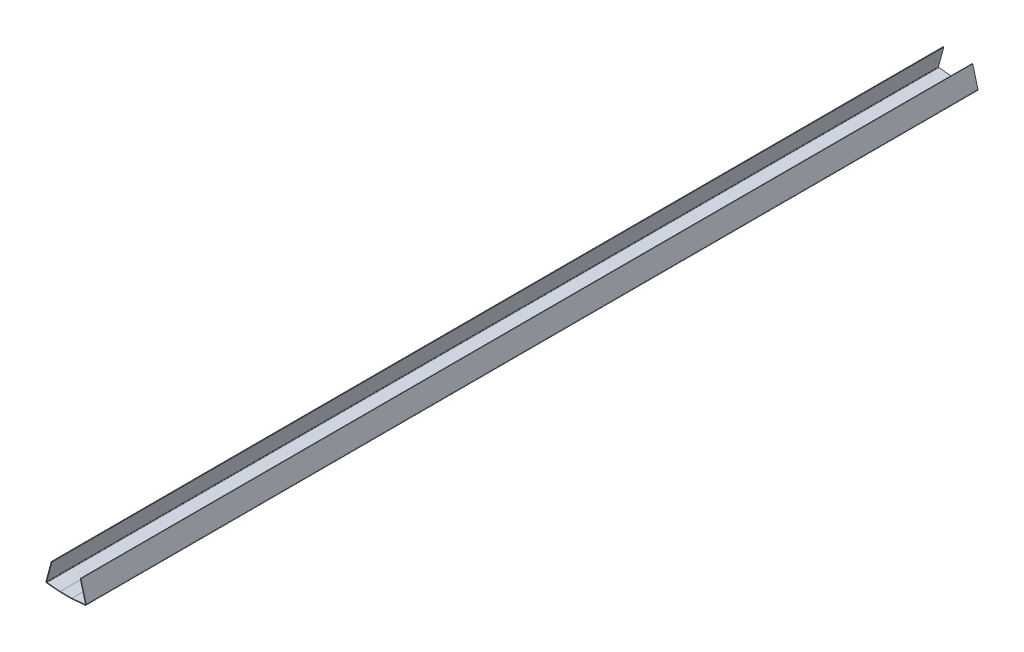
ISO-10303-21;
HEADER;
FILE_DESCRIPTION(('STEP AP214'),'2;1');
FILE_NAME('part.step','',(''),(''),'','','');
FILE_SCHEMA(('AUTOMOTIVE_DESIGN { 1 0 10303 214 1 1 1 1 }'));
ENDSEC;
DATA;
#1=APPLICATION_CONTEXT('core data for automotive mechanical design processes');
#2=APPLICATION_PROTOCOL_DEFINITION('international standard','automotive_design',2000,#1);
#3=PRODUCT_CONTEXT('',#1,'mechanical');
#4=PRODUCT('Part','Part','',(#3));
#5=PRODUCT_RELATED_PRODUCT_CATEGORY('part','',(#4));
#6=PRODUCT_DEFINITION_FORMATION('','',#4);
#7=PRODUCT_DEFINITION_CONTEXT('part definition',#1,'design');
#8=PRODUCT_DEFINITION('design','',#6,#7);
#9=PRODUCT_DEFINITION_SHAPE('','',#8);
#10=(LENGTH_UNIT() NAMED_UNIT(*) SI_UNIT(.MILLI.,.METRE.));
#11=(NAMED_UNIT(*) PLANE_ANGLE_UNIT() SI_UNIT($,.RADIAN.));
#12=(NAMED_UNIT(*) SI_UNIT($,.STERADIAN.) SOLID_ANGLE_UNIT());
#13=UNCERTAINTY_MEASURE_WITH_UNIT(LENGTH_MEASURE(1.E-05),#10,'distance_accuracy_value','');
#14=(GEOMETRIC_REPRESENTATION_CONTEXT(3) GLOBAL_UNCERTAINTY_ASSIGNED_CONTEXT((#13)) GLOBAL_UNIT_ASSIGNED_CONTEXT((#10,
#11,#12)) REPRESENTATION_CONTEXT('',''));
#15=CARTESIAN_POINT('',(0.,0.,0.));
#16=DIRECTION('',(0.,0.,1.));
#17=DIRECTION('',(1.,0.,0.));
#18=AXIS2_PLACEMENT_3D('',#15,#16,#17);
#19=CARTESIAN_POINT('',(32.5086896776147,4.10552978515184,-1447.8));
#20=DIRECTION('',(0.,0.,-1.));
#21=DIRECTION('',(-1.,0.,0.));
#22=AXIS2_PLACEMENT_3D('',#19,#20,#21);
#23=PLANE('',#22);
#24=DIRECTION('',(-0.965925826289067,-0.258819045102526,0.));
#25=VECTOR('',#24,1.);
#26=CARTESIAN_POINT('',(32.5086896776147,4.10552978515184,-1447.8));
#27=LINE('',#26,#25);
#28=CARTESIAN_POINT('',(32.5086896776147,4.10552978515184,-1447.8));
#29=VERTEX_POINT('',#28);
#30=CARTESIAN_POINT('',(31.527309038105,3.84256963532774,-1447.8));
#31=VERTEX_POINT('',#30);
#32=EDGE_CURVE('E11',#29,#31,#27,.T.);
#33=ORIENTED_EDGE('',*,*,#32,.F.);
#34=CARTESIAN_POINT('',(30.7912735584728,3.64534952295957,-1447.8));
#35=DIRECTION('',(0.,0.,1.));
#36=DIRECTION('',(1.,0.,0.));
#37=AXIS2_PLACEMENT_3D('',#34,#35,#36);
#38=CIRCLE('',#37,1.778);
#39=CARTESIAN_POINT('',(30.9462364690778,1.87411534975242,-1447.8));
#40=VERTEX_POINT('',#39);
#41=EDGE_CURVE('E270',#29,#40,#38,.F.);
#42=ORIENTED_EDGE('',*,*,#41,.T.);
#43=DIRECTION('',(0.0871557427476502,-0.996194698091747,0.));
#44=VECTOR('',#43,1.);
#45=CARTESIAN_POINT('',(30.8576862344465,2.88624916301371,-1447.8));
#46=LINE('',#45,#44);
#47=CARTESIAN_POINT('',(30.8576862344465,2.88624916301371,-1447.8));
#48=VERTEX_POINT('',#47);
#49=EDGE_CURVE('E41',#48,#40,#46,.T.);
#50=ORIENTED_EDGE('',*,*,#49,.F.);
#51=CARTESIAN_POINT('',(30.7912735584728,3.64534952295957,-1447.8));
#52=DIRECTION('',(0.,0.,1.));
#53=DIRECTION('',(1.,0.,0.));
#54=AXIS2_PLACEMENT_3D('',#51,#52,#53);
#55=CIRCLE('',#54,0.762);
#56=EDGE_CURVE('E281',#31,#48,#55,.F.);
#57=ORIENTED_EDGE('',*,*,#56,.F.);
#58=EDGE_LOOP('',(#33,#42,#50,#57));
#59=FACE_BOUND('',#58,.T.);
#60=ADVANCED_FACE('F34',(#59),#23,.T.);
#61=CARTESIAN_POINT('',(30.8576862344465,2.88624916301371,-1447.8));
#62=DIRECTION('',(0.,0.,-1.));
#63=DIRECTION('',(-1.,0.,0.));
#64=AXIS2_PLACEMENT_3D('',#61,#62,#63);
#65=PLANE('',#64);
#66=DIRECTION('',(0.258819045102526,-0.965925826289067,0.));
#67=VECTOR('',#66,1.);
#68=CARTESIAN_POINT('',(33.0571111583233,2.05879295518523,-1447.8));
#69=LINE('',#68,#67);
#70=CARTESIAN_POINT('',(24.0178560081175,35.7937524383308,-1447.8));
#71=VERTEX_POINT('',#70);
#72=EDGE_CURVE('E273',#71,#29,#69,.T.);
#73=ORIENTED_EDGE('',*,*,#72,.T.);
#74=ORIENTED_EDGE('',*,*,#32,.T.);
#75=DIRECTION('',(0.258819045102526,-0.965925826289067,0.));
#76=VECTOR('',#75,1.);
#77=CARTESIAN_POINT('',(32.0757305188135,1.79583280536101,-1447.8));
#78=LINE('',#77,#76);
#79=CARTESIAN_POINT('',(23.0364753686079,35.5307922885067,-1447.8));
#80=VERTEX_POINT('',#79);
#81=EDGE_CURVE('E278',#80,#31,#78,.T.);
#82=ORIENTED_EDGE('',*,*,#81,.F.);
#83=DIRECTION('',(0.965925826289069,0.258819045102519,0.));
#84=VECTOR('',#83,1.);
#85=CARTESIAN_POINT('',(23.0364753686079,35.5307922885067,-1447.8));
#86=LINE('',#85,#84);
#87=EDGE_CURVE('E276',#80,#71,#86,.T.);
#88=ORIENTED_EDGE('',*,*,#87,.T.);
#89=EDGE_LOOP('',(#73,#74,#82,#88));
#90=FACE_BOUND('',#89,.T.);
#91=ADVANCED_FACE('F421',(#90),#65,.T.);
#92=CARTESIAN_POINT('',(30.946236469078,1.87411534975243,0.));
#93=DIRECTION('',(0.,0.,1.));
#94=DIRECTION('',(1.,0.,0.));
#95=AXIS2_PLACEMENT_3D('',#92,#93,#94);
#96=PLANE('',#95);
#97=DIRECTION('',(-0.0871557427476502,0.996194698091747,0.));
#98=VECTOR('',#97,1.);
#99=CARTESIAN_POINT('',(30.946236469078,1.87411534975243,0.));
#100=LINE('',#99,#98);
#101=CARTESIAN_POINT('',(30.946236469078,1.87411534975243,0.));
#102=VERTEX_POINT('',#101);
#103=CARTESIAN_POINT('',(30.8576862344464,2.88624916301362,-1.11022302462516E-13));
#104=VERTEX_POINT('',#103);
#105=EDGE_CURVE('E377',#102,#104,#100,.T.);
#106=ORIENTED_EDGE('',*,*,#105,.F.);
#107=CARTESIAN_POINT('',(30.7912735584727,3.64534952295954,-1.11022302462516E-13));
#108=DIRECTION('',(0.,0.,1.));
#109=DIRECTION('',(1.,0.,0.));
#110=AXIS2_PLACEMENT_3D('',#107,#108,#109);
#111=CIRCLE('',#110,1.778);
#112=CARTESIAN_POINT('',(32.5086896776144,4.10552978515184,-2.22044604925031E-13));
#113=VERTEX_POINT('',#112);
#114=EDGE_CURVE('E218',#113,#102,#111,.F.);
#115=ORIENTED_EDGE('',*,*,#114,.F.);
#116=DIRECTION('',(0.965925826289067,0.258819045102526,0.));
#117=VECTOR('',#116,1.);
#118=CARTESIAN_POINT('',(31.5273090381047,3.84256963532767,0.));
#119=LINE('',#118,#117);
#120=CARTESIAN_POINT('',(31.5273090381047,3.84256963532767,0.));
#121=VERTEX_POINT('',#120);
#122=EDGE_CURVE('E375',#121,#113,#119,.T.);
#123=ORIENTED_EDGE('',*,*,#122,.F.);
#124=CARTESIAN_POINT('',(30.7912735584727,3.64534952295954,-1.11022302462516E-13));
#125=DIRECTION('',(0.,0.,1.));
#126=DIRECTION('',(1.,0.,0.));
#127=AXIS2_PLACEMENT_3D('',#124,#125,#126);
#128=CIRCLE('',#127,0.762);
#129=EDGE_CURVE('E229',#121,#104,#128,.F.);
#130=ORIENTED_EDGE('',*,*,#129,.T.);
#131=EDGE_LOOP('',(#106,#115,#123,#130));
#132=FACE_BOUND('',#131,.T.);
#133=ADVANCED_FACE('F429',(#132),#96,.T.);
#134=CARTESIAN_POINT('',(31.5273090381047,3.84256963532767,0.));
#135=DIRECTION('',(0.,0.,1.));
#136=DIRECTION('',(1.,0.,0.));
#137=AXIS2_PLACEMENT_3D('',#134,#135,#136);
#138=PLANE('',#137);
#139=DIRECTION('',(-0.996194698091746,-0.0871557427476584,0.));
#140=VECTOR('',#139,1.);
#141=CARTESIAN_POINT('',(9.52500000000001,0.,0.));
#142=LINE('',#141,#140);
#143=CARTESIAN_POINT('',(9.60233375411434,0.00676582679290383,0.));
#144=VERTEX_POINT('',#143);
#145=EDGE_CURVE('E215',#102,#144,#142,.T.);
#146=ORIENTED_EDGE('',*,*,#145,.F.);
#147=ORIENTED_EDGE('',*,*,#105,.T.);
#148=DIRECTION('',(-0.996194698091746,-0.0871557427476584,0.));
#149=VECTOR('',#148,1.);
#150=CARTESIAN_POINT('',(9.43644976536828,1.01213381326121,-1.11022302462516E-13));
#151=LINE('',#150,#149);
#152=CARTESIAN_POINT('',(9.51378351948273,1.0188996400541,0.));
#153=VERTEX_POINT('',#152);
#154=EDGE_CURVE('E232',#104,#153,#151,.T.);
#155=ORIENTED_EDGE('',*,*,#154,.T.);
#156=DIRECTION('',(0.0871557427476583,-0.996194698091746,0.));
#157=VECTOR('',#156,1.);
#158=CARTESIAN_POINT('',(9.51378351948273,1.0188996400541,0.));
#159=LINE('',#158,#157);
#160=EDGE_CURVE('E367',#153,#144,#159,.T.);
#161=ORIENTED_EDGE('',*,*,#160,.T.);
#162=EDGE_LOOP('',(#146,#147,#155,#161));
#163=FACE_BOUND('',#162,.T.);
#164=ADVANCED_FACE('F431',(#163),#138,.T.);
#165=CARTESIAN_POINT('',(9.60233375411446,0.00676582679291771,-1447.8));
#166=DIRECTION('',(0.,0.,-1.));
#167=DIRECTION('',(-1.,0.,0.));
#168=AXIS2_PLACEMENT_3D('',#165,#166,#167);
#169=PLANE('',#168);
#170=DIRECTION('',(-0.0871557427476583,0.996194698091746,0.));
#171=VECTOR('',#170,1.);
#172=CARTESIAN_POINT('',(9.60233375411446,0.00676582679291771,-1447.8));
#173=LINE('',#172,#171);
#174=CARTESIAN_POINT('',(9.60233375411446,0.00676582679291771,-1447.8));
#175=VERTEX_POINT('',#174);
#176=CARTESIAN_POINT('',(9.51378351948273,1.01889964005407,-1447.8));
#177=VERTEX_POINT('',#176);
#178=EDGE_CURVE('E373',#175,#177,#173,.T.);
#179=ORIENTED_EDGE('',*,*,#178,.F.);
#180=CARTESIAN_POINT('',(9.44737084350911,1.77800000000007,-1447.8));
#181=DIRECTION('',(0.,0.,1.));
#182=DIRECTION('',(1.,0.,0.));
#183=AXIS2_PLACEMENT_3D('',#180,#181,#182);
#184=CIRCLE('',#183,1.778);
#185=CARTESIAN_POINT('',(9.44737084350911,0.,-1447.8));
#186=VERTEX_POINT('',#185);
#187=EDGE_CURVE('E264',#175,#186,#184,.F.);
#188=ORIENTED_EDGE('',*,*,#187,.T.);
#189=DIRECTION('',(0.,-1.,0.));
#190=VECTOR('',#189,1.);
#191=CARTESIAN_POINT('',(9.447370843509,1.01600000000006,-1447.8));
#192=LINE('',#191,#190);
#193=CARTESIAN_POINT('',(9.447370843509,1.01600000000006,-1447.8));
#194=VERTEX_POINT('',#193);
#195=EDGE_CURVE('E371',#194,#186,#192,.T.);
#196=ORIENTED_EDGE('',*,*,#195,.F.);
#197=CARTESIAN_POINT('',(9.44737084350911,1.77800000000007,-1447.8));
#198=DIRECTION('',(0.,0.,1.));
#199=DIRECTION('',(1.,0.,0.));
#200=AXIS2_PLACEMENT_3D('',#197,#198,#199);
#201=CIRCLE('',#200,0.762);
#202=EDGE_CURVE('E287',#177,#194,#201,.F.);
#203=ORIENTED_EDGE('',*,*,#202,.F.);
#204=EDGE_LOOP('',(#179,#188,#196,#203));
#205=FACE_BOUND('',#204,.T.);
#206=ADVANCED_FACE('F401',(#205),#169,.T.);
#207=CARTESIAN_POINT('',(9.447370843509,1.01600000000006,-1447.8));
#208=DIRECTION('',(0.,0.,-1.));
#209=DIRECTION('',(-1.,0.,0.));
#210=AXIS2_PLACEMENT_3D('',#207,#208,#209);
#211=PLANE('',#210);
#212=DIRECTION('',(-0.996194698091746,-0.0871557427476584,0.));
#213=VECTOR('',#212,1.);
#214=CARTESIAN_POINT('',(9.52500000000001,0.,-1447.8));
#215=LINE('',#214,#213);
#216=EDGE_CURVE('E267',#40,#175,#215,.T.);
#217=ORIENTED_EDGE('',*,*,#216,.T.);
#218=ORIENTED_EDGE('',*,*,#178,.T.);
#219=DIRECTION('',(-0.996194698091746,-0.0871557427476584,0.));
#220=VECTOR('',#219,1.);
#221=CARTESIAN_POINT('',(9.4364497653685,1.01213381326125,-1447.8));
#222=LINE('',#221,#220);
#223=EDGE_CURVE('E284',#48,#177,#222,.T.);
#224=ORIENTED_EDGE('',*,*,#223,.F.);
#225=ORIENTED_EDGE('',*,*,#49,.T.);
#226=EDGE_LOOP('',(#217,#218,#224,#225));
#227=FACE_BOUND('',#226,.T.);
#228=ADVANCED_FACE('F380',(#227),#211,.T.);
#229=CARTESIAN_POINT('',(9.447370843509,0.,-1.11022302462516E-13));
#230=DIRECTION('',(0.,0.,1.));
#231=DIRECTION('',(1.,0.,0.));
#232=AXIS2_PLACEMENT_3D('',#229,#230,#231);
#233=PLANE('',#232);
#234=DIRECTION('',(0.,1.,0.));
#235=VECTOR('',#234,1.);
#236=CARTESIAN_POINT('',(9.447370843509,0.,-1.11022302462516E-13));
#237=LINE('',#236,#235);
#238=CARTESIAN_POINT('',(9.447370843509,0.,-1.11022302462516E-13));
#239=VERTEX_POINT('',#238);
#240=CARTESIAN_POINT('',(9.447370843509,1.016,-1.11022302462516E-13));
#241=VERTEX_POINT('',#240);
#242=EDGE_CURVE('E369',#239,#241,#237,.T.);
#243=ORIENTED_EDGE('',*,*,#242,.F.);
#244=CARTESIAN_POINT('',(9.447370843509,1.778,-1.11022302462516E-13));
#245=DIRECTION('',(0.,0.,1.));
#246=DIRECTION('',(1.,0.,0.));
#247=AXIS2_PLACEMENT_3D('',#244,#245,#246);
#248=CIRCLE('',#247,1.778);
#249=EDGE_CURVE('E212',#144,#239,#248,.F.);
#250=ORIENTED_EDGE('',*,*,#249,.F.);
#251=ORIENTED_EDGE('',*,*,#160,.F.);
#252=CARTESIAN_POINT('',(9.447370843509,1.778,-1.11022302462516E-13));
#253=DIRECTION('',(0.,0.,1.));
#254=DIRECTION('',(1.,0.,0.));
#255=AXIS2_PLACEMENT_3D('',#252,#253,#254);
#256=CIRCLE('',#255,0.762);
#257=EDGE_CURVE('E235',#153,#241,#256,.F.);
#258=ORIENTED_EDGE('',*,*,#257,.T.);
#259=EDGE_LOOP('',(#243,#250,#251,#258));
#260=FACE_BOUND('',#259,.T.);
#261=ADVANCED_FACE('F433',(#260),#233,.T.);
#262=CARTESIAN_POINT('',(9.51378351948273,1.0188996400541,0.));
#263=DIRECTION('',(0.,0.,1.));
#264=DIRECTION('',(1.,0.,0.));
#265=AXIS2_PLACEMENT_3D('',#262,#263,#264);
#266=PLANE('',#265);
#267=DIRECTION('',(-1.,0.,0.));
#268=VECTOR('',#267,1.);
#269=CARTESIAN_POINT('',(-9.52500000000023,0.,0.));
#270=LINE('',#269,#268);
#271=CARTESIAN_POINT('',(-9.44737084350889,0.,0.));
#272=VERTEX_POINT('',#271);
#273=EDGE_CURVE('E209',#239,#272,#270,.T.);
#274=ORIENTED_EDGE('',*,*,#273,.F.);
#275=ORIENTED_EDGE('',*,*,#242,.T.);
#276=DIRECTION('',(-1.,0.,0.));
#277=VECTOR('',#276,1.);
#278=CARTESIAN_POINT('',(-9.52500000000012,1.01599999999999,0.));
#279=LINE('',#278,#277);
#280=CARTESIAN_POINT('',(-9.44737084350877,1.016,-1.11022302462516E-13));
#281=VERTEX_POINT('',#280);
#282=EDGE_CURVE('E238',#241,#281,#279,.T.);
#283=ORIENTED_EDGE('',*,*,#282,.T.);
#284=DIRECTION('',(0.,-1.,0.));
#285=VECTOR('',#284,1.);
#286=CARTESIAN_POINT('',(-9.44737084350877,1.016,-1.11022302462516E-13));
#287=LINE('',#286,#285);
#288=EDGE_CURVE('E359',#281,#272,#287,.T.);
#289=ORIENTED_EDGE('',*,*,#288,.T.);
#290=EDGE_LOOP('',(#274,#275,#283,#289));
#291=FACE_BOUND('',#290,.T.);
#292=ADVANCED_FACE('F439',(#291),#266,.T.);
#293=CARTESIAN_POINT('',(-9.44737084350877,0.,-1447.8));
#294=DIRECTION('',(0.,0.,-1.));
#295=DIRECTION('',(-1.,0.,0.));
#296=AXIS2_PLACEMENT_3D('',#293,#294,#295);
#297=PLANE('',#296);
#298=DIRECTION('',(0.,1.,0.));
#299=VECTOR('',#298,1.);
#300=CARTESIAN_POINT('',(-9.44737084350877,0.,-1447.8));
#301=LINE('',#300,#299);
#302=CARTESIAN_POINT('',(-9.44737084350877,0.,-1447.8));
#303=VERTEX_POINT('',#302);
#304=CARTESIAN_POINT('',(-9.44737084350866,1.016,-1447.8));
#305=VERTEX_POINT('',#304);
#306=EDGE_CURVE('E365',#303,#305,#301,.T.);
#307=ORIENTED_EDGE('',*,*,#306,.F.);
#308=CARTESIAN_POINT('',(-9.44737084350877,1.77800000000002,-1447.8));
#309=DIRECTION('',(0.,0.,1.));
#310=DIRECTION('',(1.,0.,0.));
#311=AXIS2_PLACEMENT_3D('',#308,#309,#310);
#312=CIRCLE('',#311,1.778);
#313=CARTESIAN_POINT('',(-9.60233375411401,0.00676582679291771,-1447.8));
#314=VERTEX_POINT('',#313);
#315=EDGE_CURVE('E258',#303,#314,#312,.F.);
#316=ORIENTED_EDGE('',*,*,#315,.T.);
#317=DIRECTION('',(-0.0871557427476586,-0.996194698091746,0.));
#318=VECTOR('',#317,1.);
#319=CARTESIAN_POINT('',(-9.51378351948251,1.01889964005412,-1447.8));
#320=LINE('',#319,#318);
#321=CARTESIAN_POINT('',(-9.51378351948251,1.01889964005412,-1447.8));
#322=VERTEX_POINT('',#321);
#323=EDGE_CURVE('E363',#322,#314,#320,.T.);
#324=ORIENTED_EDGE('',*,*,#323,.F.);
#325=CARTESIAN_POINT('',(-9.44737084350877,1.77800000000002,-1447.8));
#326=DIRECTION('',(0.,0.,1.));
#327=DIRECTION('',(1.,0.,0.));
#328=AXIS2_PLACEMENT_3D('',#325,#326,#327);
#329=CIRCLE('',#328,0.762);
#330=EDGE_CURVE('E293',#305,#322,#329,.F.);
#331=ORIENTED_EDGE('',*,*,#330,.F.);
#332=EDGE_LOOP('',(#307,#316,#324,#331));
#333=FACE_BOUND('',#332,.T.);
#334=ADVANCED_FACE('F485',(#333),#297,.T.);
#335=CARTESIAN_POINT('',(-9.51378351948251,1.01889964005412,-1447.8));
#336=DIRECTION('',(0.,0.,-1.));
#337=DIRECTION('',(-1.,0.,0.));
#338=AXIS2_PLACEMENT_3D('',#335,#336,#337);
#339=PLANE('',#338);
#340=DIRECTION('',(-1.,0.,0.));
#341=VECTOR('',#340,1.);
#342=CARTESIAN_POINT('',(-9.52499999999978,0.,-1447.8));
#343=LINE('',#342,#341);
#344=EDGE_CURVE('E261',#186,#303,#343,.T.);
#345=ORIENTED_EDGE('',*,*,#344,.T.);
#346=ORIENTED_EDGE('',*,*,#306,.T.);
#347=DIRECTION('',(-1.,0.,0.));
#348=VECTOR('',#347,1.);
#349=CARTESIAN_POINT('',(-9.5249999999999,1.01599999999998,-1447.8));
#350=LINE('',#349,#348);
#351=EDGE_CURVE('E290',#194,#305,#350,.T.);
#352=ORIENTED_EDGE('',*,*,#351,.F.);
#353=ORIENTED_EDGE('',*,*,#195,.T.);
#354=EDGE_LOOP('',(#345,#346,#352,#353));
#355=FACE_BOUND('',#354,.T.);
#356=ADVANCED_FACE('F487',(#355),#339,.T.);
#357=CARTESIAN_POINT('',(-9.60233375411401,0.0067658267928622,-1.11022302462516E-13));
#358=DIRECTION('',(0.,0.,1.));
#359=DIRECTION('',(1.,0.,0.));
#360=AXIS2_PLACEMENT_3D('',#357,#358,#359);
#361=PLANE('',#360);
#362=DIRECTION('',(0.0871557427476586,0.996194698091746,0.));
#363=VECTOR('',#362,1.);
#364=CARTESIAN_POINT('',(-9.60233375411401,0.0067658267928622,-1.11022302462516E-13));
#365=LINE('',#364,#363);
#366=CARTESIAN_POINT('',(-9.60233375411401,0.0067658267928622,-1.11022302462516E-13));
#367=VERTEX_POINT('',#366);
#368=CARTESIAN_POINT('',(-9.5137835194824,1.0188996400541,0.));
#369=VERTEX_POINT('',#368);
#370=EDGE_CURVE('E361',#367,#369,#365,.T.);
#371=ORIENTED_EDGE('',*,*,#370,.F.);
#372=CARTESIAN_POINT('',(-9.44737084350877,1.778,0.));
#373=DIRECTION('',(0.,0.,1.));
#374=DIRECTION('',(1.,0.,0.));
#375=AXIS2_PLACEMENT_3D('',#372,#373,#374);
#376=CIRCLE('',#375,1.778);
#377=EDGE_CURVE('E206',#272,#367,#376,.F.);
#378=ORIENTED_EDGE('',*,*,#377,.F.);
#379=ORIENTED_EDGE('',*,*,#288,.F.);
#380=CARTESIAN_POINT('',(-9.44737084350877,1.778,0.));
#381=DIRECTION('',(0.,0.,1.));
#382=DIRECTION('',(1.,0.,0.));
#383=AXIS2_PLACEMENT_3D('',#380,#381,#382);
#384=CIRCLE('',#383,0.762);
#385=EDGE_CURVE('E241',#281,#369,#384,.F.);
#386=ORIENTED_EDGE('',*,*,#385,.T.);
#387=EDGE_LOOP('',(#371,#378,#379,#386));
#388=FACE_BOUND('',#387,.T.);
#389=ADVANCED_FACE('F443',(#388),#361,.T.);
#390=CARTESIAN_POINT('',(-9.44737084350877,1.016,-1.11022302462516E-13));
#391=DIRECTION('',(0.,0.,1.));
#392=DIRECTION('',(1.,0.,0.));
#393=AXIS2_PLACEMENT_3D('',#390,#391,#392);
#394=PLANE('',#393);
#395=DIRECTION('',(-0.996194698091746,0.087155742747658,0.));
#396=VECTOR('',#395,1.);
#397=CARTESIAN_POINT('',(-9.52500000000023,0.,0.));
#398=LINE('',#397,#396);
#399=CARTESIAN_POINT('',(-30.9462364690779,1.87411534975242,-1.11022302462516E-13));
#400=VERTEX_POINT('',#399);
#401=EDGE_CURVE('E203',#367,#400,#398,.T.);
#402=ORIENTED_EDGE('',*,*,#401,.F.);
#403=ORIENTED_EDGE('',*,*,#370,.T.);
#404=DIRECTION('',(-0.996194698091746,0.087155742747658,0.));
#405=VECTOR('',#404,1.);
#406=CARTESIAN_POINT('',(-9.43644976536839,1.01213381326119,0.));
#407=LINE('',#406,#405);
#408=CARTESIAN_POINT('',(-30.8576862344465,2.88624916301362,-1.11022302462516E-13));
#409=VERTEX_POINT('',#408);
#410=EDGE_CURVE('E244',#369,#409,#407,.T.);
#411=ORIENTED_EDGE('',*,*,#410,.T.);
#412=DIRECTION('',(-0.0871557427476569,-0.996194698091746,0.));
#413=VECTOR('',#412,1.);
#414=CARTESIAN_POINT('',(-30.8576862344465,2.88624916301362,-1.11022302462516E-13));
#415=LINE('',#414,#413);
#416=EDGE_CURVE('E303',#409,#400,#415,.T.);
#417=ORIENTED_EDGE('',*,*,#416,.T.);
#418=EDGE_LOOP('',(#402,#403,#411,#417));
#419=FACE_BOUND('',#418,.T.);
#420=ADVANCED_FACE('F459',(#419),#394,.T.);
#421=CARTESIAN_POINT('',(-30.9462364690779,1.87411534975244,-1447.8));
#422=DIRECTION('',(0.,0.,-1.));
#423=DIRECTION('',(-1.,0.,0.));
#424=AXIS2_PLACEMENT_3D('',#421,#422,#423);
#425=PLANE('',#424);
#426=DIRECTION('',(0.0871557427476569,0.996194698091746,0.));
#427=VECTOR('',#426,1.);
#428=CARTESIAN_POINT('',(-30.9462364690779,1.87411534975244,-1447.8));
#429=LINE('',#428,#427);
#430=CARTESIAN_POINT('',(-30.9462364690779,1.87411534975244,-1447.8));
#431=VERTEX_POINT('',#430);
#432=CARTESIAN_POINT('',(-30.8576862344463,2.88624916301371,-1447.8));
#433=VERTEX_POINT('',#432);
#434=EDGE_CURVE('E56',#431,#433,#429,.T.);
#435=ORIENTED_EDGE('',*,*,#434,.F.);
#436=CARTESIAN_POINT('',(-30.7912735584726,3.64534952295954,-1447.8));
#437=DIRECTION('',(0.,0.,1.));
#438=DIRECTION('',(1.,0.,0.));
#439=AXIS2_PLACEMENT_3D('',#436,#437,#438);
#440=CIRCLE('',#439,1.778);
#441=CARTESIAN_POINT('',(-32.5086896776146,4.10552978515184,-1447.8));
#442=VERTEX_POINT('',#441);
#443=EDGE_CURVE('E254',#431,#442,#440,.F.);
#444=ORIENTED_EDGE('',*,*,#443,.T.);
#445=DIRECTION('',(-0.965925826289068,0.258819045102525,0.));
#446=VECTOR('',#445,1.);
#447=CARTESIAN_POINT('',(-31.5273090381049,3.84256963532774,-1447.8));
#448=LINE('',#447,#446);
#449=CARTESIAN_POINT('',(-31.5273090381049,3.84256963532774,-1447.8));
#450=VERTEX_POINT('',#449);
#451=EDGE_CURVE('E48',#450,#442,#448,.T.);
#452=ORIENTED_EDGE('',*,*,#451,.F.);
#453=CARTESIAN_POINT('',(-30.7912735584726,3.64534952295954,-1447.8));
#454=DIRECTION('',(0.,0.,1.));
#455=DIRECTION('',(1.,0.,0.));
#456=AXIS2_PLACEMENT_3D('',#453,#454,#455);
#457=CIRCLE('',#456,0.762);
#458=EDGE_CURVE('E183',#433,#450,#457,.F.);
#459=ORIENTED_EDGE('',*,*,#458,.F.);
#460=EDGE_LOOP('',(#435,#444,#452,#459));
#461=FACE_BOUND('',#460,.T.);
#462=ADVANCED_FACE('F475',(#461),#425,.T.);
#463=CARTESIAN_POINT('',(-31.5273090381049,3.84256963532774,-1447.8));
#464=DIRECTION('',(0.,0.,-1.));
#465=DIRECTION('',(-1.,0.,0.));
#466=AXIS2_PLACEMENT_3D('',#463,#464,#465);
#467=PLANE('',#466);
#468=DIRECTION('',(-0.996194698091746,0.087155742747658,0.));
#469=VECTOR('',#468,1.);
#470=CARTESIAN_POINT('',(-9.52499999999978,0.,-1447.8));
#471=LINE('',#470,#469);
#472=EDGE_CURVE('E256',#314,#431,#471,.T.);
#473=ORIENTED_EDGE('',*,*,#472,.T.);
#474=ORIENTED_EDGE('',*,*,#434,.T.);
#475=DIRECTION('',(-0.996194698091746,0.087155742747658,0.));
#476=VECTOR('',#475,1.);
#477=CARTESIAN_POINT('',(-9.4364497653685,1.01213381326125,-1447.8));
#478=LINE('',#477,#476);
#479=EDGE_CURVE('E296',#322,#433,#478,.T.);
#480=ORIENTED_EDGE('',*,*,#479,.F.);
#481=ORIENTED_EDGE('',*,*,#323,.T.);
#482=EDGE_LOOP('',(#473,#474,#480,#481));
#483=FACE_BOUND('',#482,.T.);
#484=ADVANCED_FACE('F477',(#483),#467,.T.);
#485=CARTESIAN_POINT('',(-32.5086896776147,4.10552978515183,-1.11022302462516E-13));
#486=DIRECTION('',(0.,0.,1.));
#487=DIRECTION('',(1.,0.,0.));
#488=AXIS2_PLACEMENT_3D('',#485,#486,#487);
#489=PLANE('',#488);
#490=DIRECTION('',(0.965925826289068,-0.258819045102525,0.));
#491=VECTOR('',#490,1.);
#492=CARTESIAN_POINT('',(-32.5086896776147,4.10552978515183,-1.11022302462516E-13));
#493=LINE('',#492,#491);
#494=CARTESIAN_POINT('',(-32.5086896776147,4.10552978515183,-1.11022302462516E-13));
#495=VERTEX_POINT('',#494);
#496=CARTESIAN_POINT('',(-31.5273090381051,3.84256963532766,0.));
#497=VERTEX_POINT('',#496);
#498=EDGE_CURVE('E195',#495,#497,#493,.T.);
#499=ORIENTED_EDGE('',*,*,#498,.F.);
#500=CARTESIAN_POINT('',(-30.7912735584727,3.64534952295953,-1.11022302462516E-13));
#501=DIRECTION('',(0.,0.,1.));
#502=DIRECTION('',(1.,0.,0.));
#503=AXIS2_PLACEMENT_3D('',#500,#501,#502);
#504=CIRCLE('',#503,1.778);
#505=EDGE_CURVE('E200',#400,#495,#504,.F.);
#506=ORIENTED_EDGE('',*,*,#505,.F.);
#507=ORIENTED_EDGE('',*,*,#416,.F.);
#508=CARTESIAN_POINT('',(-30.7912735584727,3.64534952295953,-1.11022302462516E-13));
#509=DIRECTION('',(0.,0.,1.));
#510=DIRECTION('',(1.,0.,0.));
#511=AXIS2_PLACEMENT_3D('',#508,#509,#510);
#512=CIRCLE('',#511,0.762);
#513=EDGE_CURVE('E247',#409,#497,#512,.F.);
#514=ORIENTED_EDGE('',*,*,#513,.T.);
#515=EDGE_LOOP('',(#499,#506,#507,#514));
#516=FACE_BOUND('',#515,.T.);
#517=ADVANCED_FACE('F463',(#516),#489,.T.);
#518=CARTESIAN_POINT('',(-30.8576862344465,2.88624916301362,-1.11022302462516E-13));
#519=DIRECTION('',(0.,0.,1.));
#520=DIRECTION('',(1.,0.,0.));
#521=AXIS2_PLACEMENT_3D('',#518,#519,#520);
#522=PLANE('',#521);
#523=DIRECTION('',(0.258819045102525,0.965925826289067,0.));
#524=VECTOR('',#523,1.);
#525=CARTESIAN_POINT('',(-33.0571111583233,2.05879295518517,-1.11022302462516E-13));
#526=LINE('',#525,#524);
#527=CARTESIAN_POINT('',(-24.0178560081177,35.7937524383308,-1.11022302462516E-13));
#528=VERTEX_POINT('',#527);
#529=EDGE_CURVE('E192',#495,#528,#526,.T.);
#530=ORIENTED_EDGE('',*,*,#529,.F.);
#531=ORIENTED_EDGE('',*,*,#498,.T.);
#532=DIRECTION('',(0.258819045102525,0.965925826289067,0.));
#533=VECTOR('',#532,1.);
#534=CARTESIAN_POINT('',(-32.0757305188136,1.79583280536101,0.));
#535=LINE('',#534,#533);
#536=CARTESIAN_POINT('',(-23.0364753686079,35.5307922885067,0.));
#537=VERTEX_POINT('',#536);
#538=EDGE_CURVE('E176',#497,#537,#535,.T.);
#539=ORIENTED_EDGE('',*,*,#538,.T.);
#540=DIRECTION('',(0.965925826289071,-0.258819045102512,0.));
#541=VECTOR('',#540,1.);
#542=CARTESIAN_POINT('',(-24.0178560081177,35.7937524383308,-1.11022302462516E-13));
#543=LINE('',#542,#541);
#544=EDGE_CURVE('E187',#528,#537,#543,.T.);
#545=ORIENTED_EDGE('',*,*,#544,.F.);
#546=EDGE_LOOP('',(#530,#531,#539,#545));
#547=FACE_BOUND('',#546,.T.);
#548=ADVANCED_FACE('F194',(#547),#522,.T.);
#549=CARTESIAN_POINT('',(-32.0757305188135,1.79583280536104,-1447.8));
#550=DIRECTION('',(0.965925826289067,-0.258819045102525,0.));
#551=DIRECTION('',(0.258819045102525,0.965925826289067,0.));
#552=AXIS2_PLACEMENT_3D('',#549,#550,#551);
#553=PLANE('',#552);
#554=ORIENTED_EDGE('',*,*,#538,.F.);
#555=DIRECTION('',(0.,0.,1.));
#556=VECTOR('',#555,1.);
#557=CARTESIAN_POINT('',(-31.5273090381049,3.84256963532774,-1447.8));
#558=LINE('',#557,#556);
#559=EDGE_CURVE('E301',#450,#497,#558,.T.);
#560=ORIENTED_EDGE('',*,*,#559,.F.);
#561=DIRECTION('',(0.258819045102525,0.965925826289067,0.));
#562=VECTOR('',#561,1.);
#563=CARTESIAN_POINT('',(-32.0757305188135,1.79583280536104,-1447.8));
#564=LINE('',#563,#562);
#565=CARTESIAN_POINT('',(-23.0364753686079,35.5307922885067,-1447.8));
#566=VERTEX_POINT('',#565);
#567=EDGE_CURVE('E179',#450,#566,#564,.T.);
#568=ORIENTED_EDGE('',*,*,#567,.T.);
#569=DIRECTION('',(0.,0.,1.));
#570=VECTOR('',#569,1.);
#571=CARTESIAN_POINT('',(-23.0364753686079,35.5307922885067,-1447.8));
#572=LINE('',#571,#570);
#573=EDGE_CURVE('E172',#566,#537,#572,.T.);
#574=ORIENTED_EDGE('',*,*,#573,.T.);
#575=EDGE_LOOP('',(#554,#560,#568,#574));
#576=FACE_BOUND('',#575,.T.);
#577=ADVANCED_FACE('F174',(#576),#553,.T.);
#578=CARTESIAN_POINT('',(-30.7912735584726,3.64534952295954,-1447.8));
#579=DIRECTION('',(0.,0.,1.));
#580=DIRECTION('',(1.,0.,0.));
#581=AXIS2_PLACEMENT_3D('',#578,#579,#580);
#582=CYLINDRICAL_SURFACE('',#581,0.762);
#583=ORIENTED_EDGE('',*,*,#513,.F.);
#584=DIRECTION('',(0.,0.,1.));
#585=VECTOR('',#584,1.);
#586=CARTESIAN_POINT('',(-30.8576862344463,2.88624916301371,-1447.8));
#587=LINE('',#586,#585);
#588=EDGE_CURVE('E304',#433,#409,#587,.T.);
#589=ORIENTED_EDGE('',*,*,#588,.F.);
#590=ORIENTED_EDGE('',*,*,#458,.T.);
#591=ORIENTED_EDGE('',*,*,#559,.T.);
#592=EDGE_LOOP('',(#583,#589,#590,#591));
#593=FACE_BOUND('',#592,.T.);
#594=ADVANCED_FACE('F461',(#593),#582,.F.);
#595=CARTESIAN_POINT('',(-9.4364497653685,1.01213381326125,-1447.8));
#596=DIRECTION('',(0.087155742747658,0.996194698091746,0.));
#597=DIRECTION('',(-0.996194698091746,0.087155742747658,0.));
#598=AXIS2_PLACEMENT_3D('',#595,#596,#597);
#599=PLANE('',#598);
#600=ORIENTED_EDGE('',*,*,#410,.F.);
#601=DIRECTION('',(0.,0.,1.));
#602=VECTOR('',#601,1.);
#603=CARTESIAN_POINT('',(-9.51378351948251,1.01889964005412,-1447.8));
#604=LINE('',#603,#602);
#605=EDGE_CURVE('E307',#322,#369,#604,.T.);
#606=ORIENTED_EDGE('',*,*,#605,.F.);
#607=ORIENTED_EDGE('',*,*,#479,.T.);
#608=ORIENTED_EDGE('',*,*,#588,.T.);
#609=EDGE_LOOP('',(#600,#606,#607,#608));
#610=FACE_BOUND('',#609,.T.);
#611=ADVANCED_FACE('F455',(#610),#599,.T.);
#612=CARTESIAN_POINT('',(-9.44737084350877,1.77800000000002,-1447.8));
#613=DIRECTION('',(0.,0.,1.));
#614=DIRECTION('',(1.,0.,0.));
#615=AXIS2_PLACEMENT_3D('',#612,#613,#614);
#616=CYLINDRICAL_SURFACE('',#615,0.762);
#617=ORIENTED_EDGE('',*,*,#385,.F.);
#618=DIRECTION('',(0.,0.,1.));
#619=VECTOR('',#618,1.);
#620=CARTESIAN_POINT('',(-9.44737084350866,1.016,-1447.8));
#621=LINE('',#620,#619);
#622=EDGE_CURVE('E310',#305,#281,#621,.T.);
#623=ORIENTED_EDGE('',*,*,#622,.F.);
#624=ORIENTED_EDGE('',*,*,#330,.T.);
#625=ORIENTED_EDGE('',*,*,#605,.T.);
#626=EDGE_LOOP('',(#617,#623,#624,#625));
#627=FACE_BOUND('',#626,.T.);
#628=ADVANCED_FACE('F451',(#627),#616,.F.);
#629=CARTESIAN_POINT('',(-9.5249999999999,1.01599999999998,-1447.8));
#630=DIRECTION('',(0.,1.,0.));
#631=DIRECTION('',(-1.,0.,0.));
#632=AXIS2_PLACEMENT_3D('',#629,#630,#631);
#633=PLANE('',#632);
#634=ORIENTED_EDGE('',*,*,#282,.F.);
#635=DIRECTION('',(0.,0.,1.));
#636=VECTOR('',#635,1.);
#637=CARTESIAN_POINT('',(9.447370843509,1.01600000000006,-1447.8));
#638=LINE('',#637,#636);
#639=EDGE_CURVE('E313',#194,#241,#638,.T.);
#640=ORIENTED_EDGE('',*,*,#639,.F.);
#641=ORIENTED_EDGE('',*,*,#351,.T.);
#642=ORIENTED_EDGE('',*,*,#622,.T.);
#643=EDGE_LOOP('',(#634,#640,#641,#642));
#644=FACE_BOUND('',#643,.T.);
#645=ADVANCED_FACE('F447',(#644),#633,.T.);
#646=CARTESIAN_POINT('',(9.44737084350911,1.77800000000007,-1447.8));
#647=DIRECTION('',(0.,0.,1.));
#648=DIRECTION('',(1.,0.,0.));
#649=AXIS2_PLACEMENT_3D('',#646,#647,#648);
#650=CYLINDRICAL_SURFACE('',#649,0.762);
#651=ORIENTED_EDGE('',*,*,#257,.F.);
#652=DIRECTION('',(0.,0.,1.));
#653=VECTOR('',#652,1.);
#654=CARTESIAN_POINT('',(9.51378351948273,1.01889964005407,-1447.8));
#655=LINE('',#654,#653);
#656=EDGE_CURVE('E316',#177,#153,#655,.T.);
#657=ORIENTED_EDGE('',*,*,#656,.F.);
#658=ORIENTED_EDGE('',*,*,#202,.T.);
#659=ORIENTED_EDGE('',*,*,#639,.T.);
#660=EDGE_LOOP('',(#651,#657,#658,#659));
#661=FACE_BOUND('',#660,.T.);
#662=ADVANCED_FACE('F407',(#661),#650,.F.);
#663=CARTESIAN_POINT('',(9.4364497653685,1.01213381326125,-1447.8));
#664=DIRECTION('',(-0.0871557427476584,0.996194698091746,0.));
#665=DIRECTION('',(-0.996194698091746,-0.0871557427476584,0.));
#666=AXIS2_PLACEMENT_3D('',#663,#664,#665);
#667=PLANE('',#666);
#668=ORIENTED_EDGE('',*,*,#154,.F.);
#669=DIRECTION('',(0.,0.,1.));
#670=VECTOR('',#669,1.);
#671=CARTESIAN_POINT('',(30.8576862344465,2.88624916301371,-1447.8));
#672=LINE('',#671,#670);
#673=EDGE_CURVE('E319',#48,#104,#672,.T.);
#674=ORIENTED_EDGE('',*,*,#673,.F.);
#675=ORIENTED_EDGE('',*,*,#223,.T.);
#676=ORIENTED_EDGE('',*,*,#656,.T.);
#677=EDGE_LOOP('',(#668,#674,#675,#676));
#678=FACE_BOUND('',#677,.T.);
#679=ADVANCED_FACE('F410',(#678),#667,.T.);
#680=CARTESIAN_POINT('',(30.7912735584728,3.64534952295957,-1447.8));
#681=DIRECTION('',(0.,0.,1.));
#682=DIRECTION('',(1.,0.,0.));
#683=AXIS2_PLACEMENT_3D('',#680,#681,#682);
#684=CYLINDRICAL_SURFACE('',#683,0.762);
#685=ORIENTED_EDGE('',*,*,#129,.F.);
#686=DIRECTION('',(0.,0.,1.));
#687=VECTOR('',#686,1.);
#688=CARTESIAN_POINT('',(31.527309038105,3.84256963532774,-1447.8));
#689=LINE('',#688,#687);
#690=EDGE_CURVE('E322',#31,#121,#689,.T.);
#691=ORIENTED_EDGE('',*,*,#690,.F.);
#692=ORIENTED_EDGE('',*,*,#56,.T.);
#693=ORIENTED_EDGE('',*,*,#673,.T.);
#694=EDGE_LOOP('',(#685,#691,#692,#693));
#695=FACE_BOUND('',#694,.T.);
#696=ADVANCED_FACE('F413',(#695),#684,.F.);
#697=CARTESIAN_POINT('',(32.0757305188135,1.79583280536101,-1447.8));
#698=DIRECTION('',(-0.965925826289067,-0.258819045102526,0.));
#699=DIRECTION('',(0.258819045102526,-0.965925826289067,0.));
#700=AXIS2_PLACEMENT_3D('',#697,#698,#699);
#701=PLANE('',#700);
#702=DIRECTION('',(0.258819045102526,-0.965925826289067,0.));
#703=VECTOR('',#702,1.);
#704=CARTESIAN_POINT('',(32.0757305188134,1.79583280536101,0.));
#705=LINE('',#704,#703);
#706=CARTESIAN_POINT('',(23.0364753686076,35.5307922885067,-1.11022302462516E-13));
#707=VERTEX_POINT('',#706);
#708=EDGE_CURVE('E226',#707,#121,#705,.T.);
#709=ORIENTED_EDGE('',*,*,#708,.F.);
#710=DIRECTION('',(0.,0.,1.));
#711=VECTOR('',#710,1.);
#712=CARTESIAN_POINT('',(23.0364753686079,35.5307922885067,-1447.8));
#713=LINE('',#712,#711);
#714=EDGE_CURVE('E325',#80,#707,#713,.T.);
#715=ORIENTED_EDGE('',*,*,#714,.F.);
#716=ORIENTED_EDGE('',*,*,#81,.T.);
#717=ORIENTED_EDGE('',*,*,#690,.T.);
#718=EDGE_LOOP('',(#709,#715,#716,#717));
#719=FACE_BOUND('',#718,.T.);
#720=ADVANCED_FACE('F418',(#719),#701,.T.);
#721=CARTESIAN_POINT('',(23.0364753686079,35.5307922885067,-1447.8));
#722=DIRECTION('',(0.258819045102519,-0.965925826289069,0.));
#723=DIRECTION('',(0.965925826289069,0.258819045102519,0.));
#724=AXIS2_PLACEMENT_3D('',#721,#722,#723);
#725=PLANE('',#724);
#726=DIRECTION('',(0.965925826289069,0.258819045102519,0.));
#727=VECTOR('',#726,1.);
#728=CARTESIAN_POINT('',(23.0364753686076,35.5307922885067,-1.11022302462516E-13));
#729=LINE('',#728,#727);
#730=CARTESIAN_POINT('',(24.0178560081177,35.7937524383308,0.));
#731=VERTEX_POINT('',#730);
#732=EDGE_CURVE('E224',#707,#731,#729,.T.);
#733=ORIENTED_EDGE('',*,*,#732,.T.);
#734=DIRECTION('',(0.,0.,1.));
#735=VECTOR('',#734,1.);
#736=CARTESIAN_POINT('',(24.0178560081175,35.7937524383308,-1447.8));
#737=LINE('',#736,#735);
#738=EDGE_CURVE('E327',#71,#731,#737,.T.);
#739=ORIENTED_EDGE('',*,*,#738,.F.);
#740=ORIENTED_EDGE('',*,*,#87,.F.);
#741=ORIENTED_EDGE('',*,*,#714,.T.);
#742=EDGE_LOOP('',(#733,#739,#740,#741));
#743=FACE_BOUND('',#742,.T.);
#744=ADVANCED_FACE('F661',(#743),#725,.F.);
#745=CARTESIAN_POINT('',(33.0571111583233,2.05879295518523,-1447.8));
#746=DIRECTION('',(-0.965925826289067,-0.258819045102526,0.));
#747=DIRECTION('',(0.258819045102526,-0.965925826289067,0.));
#748=AXIS2_PLACEMENT_3D('',#745,#746,#747);
#749=PLANE('',#748);
#750=DIRECTION('',(0.258819045102526,-0.965925826289067,0.));
#751=VECTOR('',#750,1.);
#752=CARTESIAN_POINT('',(33.0571111583231,2.0587929551852,0.));
#753=LINE('',#752,#751);
#754=EDGE_CURVE('E221',#731,#113,#753,.T.);
#755=ORIENTED_EDGE('',*,*,#754,.T.);
#756=DIRECTION('',(0.,0.,1.));
#757=VECTOR('',#756,1.);
#758=CARTESIAN_POINT('',(32.5086896776147,4.10552978515184,-1447.8));
#759=LINE('',#758,#757);
#760=EDGE_CURVE('E330',#29,#113,#759,.T.);
#761=ORIENTED_EDGE('',*,*,#760,.F.);
#762=ORIENTED_EDGE('',*,*,#72,.F.);
#763=ORIENTED_EDGE('',*,*,#738,.T.);
#764=EDGE_LOOP('',(#755,#761,#762,#763));
#765=FACE_BOUND('',#764,.T.);
#766=ADVANCED_FACE('F426',(#765),#749,.F.);
#767=CARTESIAN_POINT('',(30.7912735584728,3.64534952295957,-1447.8));
#768=DIRECTION('',(0.,0.,1.));
#769=DIRECTION('',(1.,0.,0.));
#770=AXIS2_PLACEMENT_3D('',#767,#768,#769);
#771=CYLINDRICAL_SURFACE('',#770,1.778);
#772=ORIENTED_EDGE('',*,*,#114,.T.);
#773=DIRECTION('',(0.,0.,1.));
#774=VECTOR('',#773,1.);
#775=CARTESIAN_POINT('',(30.9462364690778,1.87411534975242,-1447.8));
#776=LINE('',#775,#774);
#777=EDGE_CURVE('E333',#40,#102,#776,.T.);
#778=ORIENTED_EDGE('',*,*,#777,.F.);
#779=ORIENTED_EDGE('',*,*,#41,.F.);
#780=ORIENTED_EDGE('',*,*,#760,.T.);
#781=EDGE_LOOP('',(#772,#778,#779,#780));
#782=FACE_BOUND('',#781,.T.);
#783=ADVANCED_FACE('F389',(#782),#771,.T.);
#784=CARTESIAN_POINT('',(9.52500000000001,0.,-1447.8));
#785=DIRECTION('',(-0.0871557427476584,0.996194698091746,0.));
#786=DIRECTION('',(-0.996194698091746,-0.0871557427476584,0.));
#787=AXIS2_PLACEMENT_3D('',#784,#785,#786);
#788=PLANE('',#787);
#789=ORIENTED_EDGE('',*,*,#145,.T.);
#790=DIRECTION('',(0.,0.,1.));
#791=VECTOR('',#790,1.);
#792=CARTESIAN_POINT('',(9.60233375411446,0.00676582679291771,-1447.8));
#793=LINE('',#792,#791);
#794=EDGE_CURVE('E336',#175,#144,#793,.T.);
#795=ORIENTED_EDGE('',*,*,#794,.F.);
#796=ORIENTED_EDGE('',*,*,#216,.F.);
#797=ORIENTED_EDGE('',*,*,#777,.T.);
#798=EDGE_LOOP('',(#789,#795,#796,#797));
#799=FACE_BOUND('',#798,.T.);
#800=ADVANCED_FACE('F393',(#799),#788,.F.);
#801=CARTESIAN_POINT('',(9.44737084350911,1.77800000000007,-1447.8));
#802=DIRECTION('',(0.,0.,1.));
#803=DIRECTION('',(1.,0.,0.));
#804=AXIS2_PLACEMENT_3D('',#801,#802,#803);
#805=CYLINDRICAL_SURFACE('',#804,1.778);
#806=ORIENTED_EDGE('',*,*,#249,.T.);
#807=DIRECTION('',(0.,0.,1.));
#808=VECTOR('',#807,1.);
#809=CARTESIAN_POINT('',(9.44737084350911,0.,-1447.8));
#810=LINE('',#809,#808);
#811=EDGE_CURVE('E339',#186,#239,#810,.T.);
#812=ORIENTED_EDGE('',*,*,#811,.F.);
#813=ORIENTED_EDGE('',*,*,#187,.F.);
#814=ORIENTED_EDGE('',*,*,#794,.T.);
#815=EDGE_LOOP('',(#806,#812,#813,#814));
#816=FACE_BOUND('',#815,.T.);
#817=ADVANCED_FACE('F398',(#816),#805,.T.);
#818=CARTESIAN_POINT('',(-9.52499999999978,0.,-1447.8));
#819=DIRECTION('',(0.,1.,0.));
#820=DIRECTION('',(-1.,0.,0.));
#821=AXIS2_PLACEMENT_3D('',#818,#819,#820);
#822=PLANE('',#821);
#823=ORIENTED_EDGE('',*,*,#273,.T.);
#824=DIRECTION('',(0.,0.,1.));
#825=VECTOR('',#824,1.);
#826=CARTESIAN_POINT('',(-9.44737084350877,0.,-1447.8));
#827=LINE('',#826,#825);
#828=EDGE_CURVE('E342',#303,#272,#827,.T.);
#829=ORIENTED_EDGE('',*,*,#828,.F.);
#830=ORIENTED_EDGE('',*,*,#344,.F.);
#831=ORIENTED_EDGE('',*,*,#811,.T.);
#832=EDGE_LOOP('',(#823,#829,#830,#831));
#833=FACE_BOUND('',#832,.T.);
#834=ADVANCED_FACE('F436',(#833),#822,.F.);
#835=CARTESIAN_POINT('',(-9.44737084350877,1.77800000000002,-1447.8));
#836=DIRECTION('',(0.,0.,1.));
#837=DIRECTION('',(1.,0.,0.));
#838=AXIS2_PLACEMENT_3D('',#835,#836,#837);
#839=CYLINDRICAL_SURFACE('',#838,1.778);
#840=ORIENTED_EDGE('',*,*,#377,.T.);
#841=DIRECTION('',(0.,0.,1.));
#842=VECTOR('',#841,1.);
#843=CARTESIAN_POINT('',(-9.60233375411401,0.00676582679291771,-1447.8));
#844=LINE('',#843,#842);
#845=EDGE_CURVE('E345',#314,#367,#844,.T.);
#846=ORIENTED_EDGE('',*,*,#845,.F.);
#847=ORIENTED_EDGE('',*,*,#315,.F.);
#848=ORIENTED_EDGE('',*,*,#828,.T.);
#849=EDGE_LOOP('',(#840,#846,#847,#848));
#850=FACE_BOUND('',#849,.T.);
#851=ADVANCED_FACE('F483',(#850),#839,.T.);
#852=CARTESIAN_POINT('',(-9.52499999999978,0.,-1447.8));
#853=DIRECTION('',(0.087155742747658,0.996194698091746,0.));
#854=DIRECTION('',(-0.996194698091746,0.087155742747658,0.));
#855=AXIS2_PLACEMENT_3D('',#852,#853,#854);
#856=PLANE('',#855);
#857=ORIENTED_EDGE('',*,*,#401,.T.);
#858=DIRECTION('',(0.,0.,1.));
#859=VECTOR('',#858,1.);
#860=CARTESIAN_POINT('',(-30.9462364690779,1.87411534975244,-1447.8));
#861=LINE('',#860,#859);
#862=EDGE_CURVE('E348',#431,#400,#861,.T.);
#863=ORIENTED_EDGE('',*,*,#862,.F.);
#864=ORIENTED_EDGE('',*,*,#472,.F.);
#865=ORIENTED_EDGE('',*,*,#845,.T.);
#866=EDGE_LOOP('',(#857,#863,#864,#865));
#867=FACE_BOUND('',#866,.T.);
#868=ADVANCED_FACE('F479',(#867),#856,.F.);
#869=CARTESIAN_POINT('',(-30.7912735584726,3.64534952295954,-1447.8));
#870=DIRECTION('',(0.,0.,1.));
#871=DIRECTION('',(1.,0.,0.));
#872=AXIS2_PLACEMENT_3D('',#869,#870,#871);
#873=CYLINDRICAL_SURFACE('',#872,1.778);
#874=ORIENTED_EDGE('',*,*,#505,.T.);
#875=DIRECTION('',(0.,0.,1.));
#876=VECTOR('',#875,1.);
#877=CARTESIAN_POINT('',(-32.5086896776146,4.10552978515184,-1447.8));
#878=LINE('',#877,#876);
#879=EDGE_CURVE('E351',#442,#495,#878,.T.);
#880=ORIENTED_EDGE('',*,*,#879,.F.);
#881=ORIENTED_EDGE('',*,*,#443,.F.);
#882=ORIENTED_EDGE('',*,*,#862,.T.);
#883=EDGE_LOOP('',(#874,#880,#881,#882));
#884=FACE_BOUND('',#883,.T.);
#885=ADVANCED_FACE('F467',(#884),#873,.T.);
#886=CARTESIAN_POINT('',(-33.0571111583231,2.0587929551852,-1447.8));
#887=DIRECTION('',(0.965925826289067,-0.258819045102526,0.));
#888=DIRECTION('',(0.258819045102525,0.965925826289067,0.));
#889=AXIS2_PLACEMENT_3D('',#886,#887,#888);
#890=PLANE('',#889);
#891=ORIENTED_EDGE('',*,*,#529,.T.);
#892=DIRECTION('',(0.,0.,1.));
#893=VECTOR('',#892,1.);
#894=CARTESIAN_POINT('',(-24.0178560081175,35.7937524383309,-1447.8));
#895=LINE('',#894,#893);
#896=CARTESIAN_POINT('',(-24.0178560081175,35.7937524383309,-1447.8));
#897=VERTEX_POINT('',#896);
#898=EDGE_CURVE('E182',#897,#528,#895,.T.);
#899=ORIENTED_EDGE('',*,*,#898,.F.);
#900=DIRECTION('',(0.258819045102525,0.965925826289067,0.));
#901=VECTOR('',#900,1.);
#902=CARTESIAN_POINT('',(-33.0571111583231,2.0587929551852,-1447.8));
#903=LINE('',#902,#901);
#904=EDGE_CURVE('E252',#442,#897,#903,.T.);
#905=ORIENTED_EDGE('',*,*,#904,.F.);
#906=ORIENTED_EDGE('',*,*,#879,.T.);
#907=EDGE_LOOP('',(#891,#899,#905,#906));
#908=FACE_BOUND('',#907,.T.);
#909=ADVANCED_FACE('F472',(#908),#890,.F.);
#910=CARTESIAN_POINT('',(-24.0178560081175,35.7937524383309,-1447.8));
#911=DIRECTION('',(-0.258819045102513,-0.965925826289071,0.));
#912=DIRECTION('',(0.965925826289071,-0.258819045102512,0.));
#913=AXIS2_PLACEMENT_3D('',#910,#911,#912);
#914=PLANE('',#913);
#915=ORIENTED_EDGE('',*,*,#544,.T.);
#916=ORIENTED_EDGE('',*,*,#573,.F.);
#917=DIRECTION('',(0.965925826289071,-0.258819045102512,0.));
#918=VECTOR('',#917,1.);
#919=CARTESIAN_POINT('',(-24.0178560081175,35.7937524383309,-1447.8));
#920=LINE('',#919,#918);
#921=EDGE_CURVE('E250',#897,#566,#920,.T.);
#922=ORIENTED_EDGE('',*,*,#921,.F.);
#923=ORIENTED_EDGE('',*,*,#898,.T.);
#924=EDGE_LOOP('',(#915,#916,#922,#923));
#925=FACE_BOUND('',#924,.T.);
#926=ADVANCED_FACE('F188',(#925),#914,.F.);
#927=CARTESIAN_POINT('',(-30.7912735584726,3.64534952295954,-1447.8));
#928=DIRECTION('',(0.,0.,1.));
#929=DIRECTION('',(1.,0.,0.));
#930=AXIS2_PLACEMENT_3D('',#927,#928,#929);
#931=PLANE('',#930);
#932=ORIENTED_EDGE('',*,*,#567,.F.);
#933=ORIENTED_EDGE('',*,*,#451,.T.);
#934=ORIENTED_EDGE('',*,*,#904,.T.);
#935=ORIENTED_EDGE('',*,*,#921,.T.);
#936=EDGE_LOOP('',(#932,#933,#934,#935));
#937=FACE_BOUND('',#936,.T.);
#938=ADVANCED_FACE('F474',(#937),#931,.F.);
#939=CARTESIAN_POINT('',(-30.7912735584727,3.64534952295953,-1.11022302462516E-13));
#940=DIRECTION('',(0.,0.,1.));
#941=DIRECTION('',(1.,0.,0.));
#942=AXIS2_PLACEMENT_3D('',#939,#940,#941);
#943=PLANE('',#942);
#944=ORIENTED_EDGE('',*,*,#708,.T.);
#945=ORIENTED_EDGE('',*,*,#122,.T.);
#946=ORIENTED_EDGE('',*,*,#754,.F.);
#947=ORIENTED_EDGE('',*,*,#732,.F.);
#948=EDGE_LOOP('',(#944,#945,#946,#947));
#949=FACE_BOUND('',#948,.T.);
#950=ADVANCED_FACE('F771',(#949),#943,.T.);
#951=CLOSED_SHELL('',(#60,#91,#133,#164,#206,#228,#261,#292,#334,#356,#389,#420,#462,#484,#517,
#548,#577,#594,#611,#628,#645,#662,#679,#696,#720,#744,#766,#783,#800,#817,#834,#851,#868,#885,
#909,#926,#938,#950));
#952=MANIFOLD_SOLID_BREP('B2',#951);
#953=ADVANCED_BREP_SHAPE_REPRESENTATION('',(#18,#952),#14);
#954=SHAPE_DEFINITION_REPRESENTATION(#9,#953);
ENDSEC;
END-ISO-10303-21;
